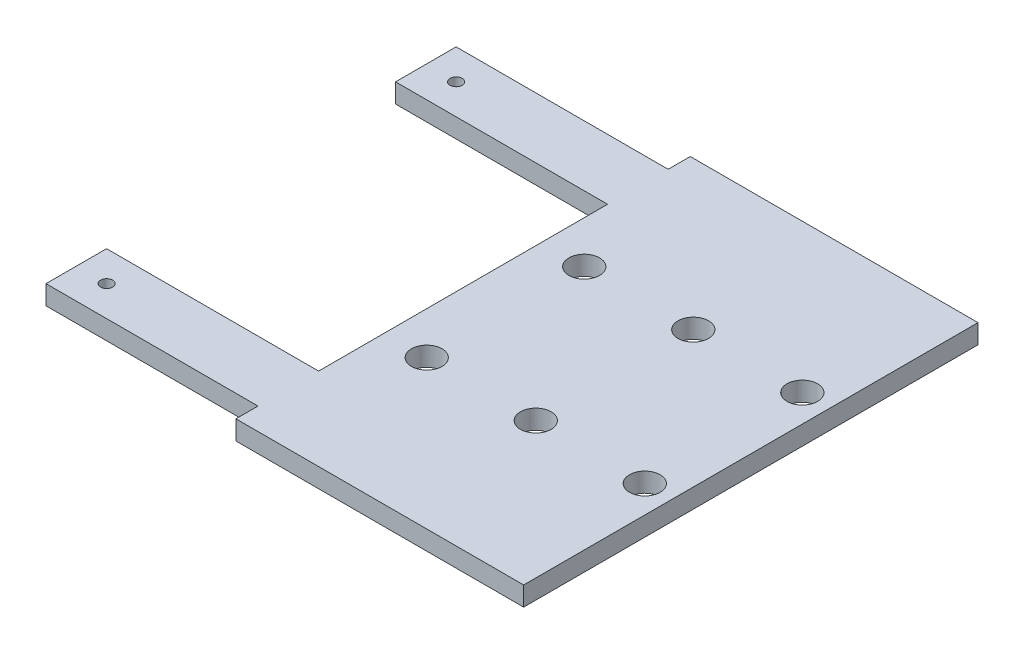
ISO-10303-21;
HEADER;
FILE_DESCRIPTION(('STEP AP214'),'2;1');
FILE_NAME('part.step','',(''),(''),'','','');
FILE_SCHEMA(('AUTOMOTIVE_DESIGN { 1 0 10303 214 1 1 1 1 }'));
ENDSEC;
DATA;
#1=APPLICATION_CONTEXT('core data for automotive mechanical design processes');
#2=APPLICATION_PROTOCOL_DEFINITION('international standard','automotive_design',2000,#1);
#3=PRODUCT_CONTEXT('',#1,'mechanical');
#4=PRODUCT('Part','Part','',(#3));
#5=PRODUCT_RELATED_PRODUCT_CATEGORY('part','',(#4));
#6=PRODUCT_DEFINITION_FORMATION('','',#4);
#7=PRODUCT_DEFINITION_CONTEXT('part definition',#1,'design');
#8=PRODUCT_DEFINITION('design','',#6,#7);
#9=PRODUCT_DEFINITION_SHAPE('','',#8);
#10=(LENGTH_UNIT() NAMED_UNIT(*) SI_UNIT(.MILLI.,.METRE.));
#11=(NAMED_UNIT(*) PLANE_ANGLE_UNIT() SI_UNIT($,.RADIAN.));
#12=(NAMED_UNIT(*) SI_UNIT($,.STERADIAN.) SOLID_ANGLE_UNIT());
#13=UNCERTAINTY_MEASURE_WITH_UNIT(LENGTH_MEASURE(1.E-05),#10,'distance_accuracy_value','');
#14=(GEOMETRIC_REPRESENTATION_CONTEXT(3) GLOBAL_UNCERTAINTY_ASSIGNED_CONTEXT((#13)) GLOBAL_UNIT_ASSIGNED_CONTEXT((#10,
#11,#12)) REPRESENTATION_CONTEXT('',''));
#15=CARTESIAN_POINT('',(0.,0.,0.));
#16=DIRECTION('',(0.,0.,1.));
#17=DIRECTION('',(1.,0.,0.));
#18=AXIS2_PLACEMENT_3D('',#15,#16,#17);
#19=CARTESIAN_POINT('',(0.,6.35,0.));
#20=DIRECTION('',(0.,-1.,0.));
#21=DIRECTION('',(0.,0.,-1.));
#22=AXIS2_PLACEMENT_3D('',#19,#20,#21);
#23=PLANE('',#22);
#24=DIRECTION('',(0.,0.,-1.));
#25=VECTOR('',#24,1.);
#26=CARTESIAN_POINT('',(45.,6.35,-75.));
#27=LINE('',#26,#25);
#28=CARTESIAN_POINT('',(45.,6.35,75.));
#29=VERTEX_POINT('',#28);
#30=CARTESIAN_POINT('',(45.,6.35,-75.));
#31=VERTEX_POINT('',#30);
#32=EDGE_CURVE('E176',#29,#31,#27,.T.);
#33=ORIENTED_EDGE('',*,*,#32,.T.);
#34=DIRECTION('',(-1.,0.,0.));
#35=VECTOR('',#34,1.);
#36=CARTESIAN_POINT('',(45.,6.35,-75.));
#37=LINE('',#36,#35);
#38=CARTESIAN_POINT('',(-50.,6.35,-75.));
#39=VERTEX_POINT('',#38);
#40=EDGE_CURVE('E104',#31,#39,#37,.T.);
#41=ORIENTED_EDGE('',*,*,#40,.T.);
#42=DIRECTION('',(0.,0.,1.));
#43=VECTOR('',#42,1.);
#44=CARTESIAN_POINT('',(-50.,6.35,-75.));
#45=LINE('',#44,#43);
#46=CARTESIAN_POINT('',(-50.,6.35,-67.7));
#47=VERTEX_POINT('',#46);
#48=EDGE_CURVE('E203',#39,#47,#45,.T.);
#49=ORIENTED_EDGE('',*,*,#48,.T.);
#50=DIRECTION('',(-1.,0.,0.));
#51=VECTOR('',#50,1.);
#52=CARTESIAN_POINT('',(-50.,6.35,-67.7));
#53=LINE('',#52,#51);
#54=CARTESIAN_POINT('',(-120.,6.35,-67.7));
#55=VERTEX_POINT('',#54);
#56=EDGE_CURVE('E222',#47,#55,#53,.T.);
#57=ORIENTED_EDGE('',*,*,#56,.T.);
#58=DIRECTION('',(0.,0.,1.));
#59=VECTOR('',#58,1.);
#60=CARTESIAN_POINT('',(-120.,6.35,-67.7));
#61=LINE('',#60,#59);
#62=CARTESIAN_POINT('',(-120.,6.35,-47.7));
#63=VERTEX_POINT('',#62);
#64=EDGE_CURVE('E219',#55,#63,#61,.T.);
#65=ORIENTED_EDGE('',*,*,#64,.T.);
#66=DIRECTION('',(1.,0.,0.));
#67=VECTOR('',#66,1.);
#68=CARTESIAN_POINT('',(-50.,6.35,-47.7));
#69=LINE('',#68,#67);
#70=CARTESIAN_POINT('',(-50.,6.35,-47.7));
#71=VERTEX_POINT('',#70);
#72=EDGE_CURVE('E221',#63,#71,#69,.T.);
#73=ORIENTED_EDGE('',*,*,#72,.T.);
#74=DIRECTION('',(0.,0.,1.));
#75=VECTOR('',#74,1.);
#76=CARTESIAN_POINT('',(-50.,6.35,47.7));
#77=LINE('',#76,#75);
#78=CARTESIAN_POINT('',(-50.,6.35,47.7));
#79=VERTEX_POINT('',#78);
#80=EDGE_CURVE('E224',#71,#79,#77,.T.);
#81=ORIENTED_EDGE('',*,*,#80,.T.);
#82=DIRECTION('',(-1.,0.,0.));
#83=VECTOR('',#82,1.);
#84=CARTESIAN_POINT('',(-120.,6.35,47.7));
#85=LINE('',#84,#83);
#86=CARTESIAN_POINT('',(-120.,6.35,47.7));
#87=VERTEX_POINT('',#86);
#88=EDGE_CURVE('E230',#79,#87,#85,.T.);
#89=ORIENTED_EDGE('',*,*,#88,.T.);
#90=DIRECTION('',(0.,0.,1.));
#91=VECTOR('',#90,1.);
#92=CARTESIAN_POINT('',(-120.,6.35,47.7));
#93=LINE('',#92,#91);
#94=CARTESIAN_POINT('',(-120.,6.35,67.7));
#95=VERTEX_POINT('',#94);
#96=EDGE_CURVE('E135',#87,#95,#93,.T.);
#97=ORIENTED_EDGE('',*,*,#96,.T.);
#98=DIRECTION('',(1.,0.,0.));
#99=VECTOR('',#98,1.);
#100=CARTESIAN_POINT('',(-120.,6.35,67.7));
#101=LINE('',#100,#99);
#102=CARTESIAN_POINT('',(-50.,6.35,67.7));
#103=VERTEX_POINT('',#102);
#104=EDGE_CURVE('E129',#95,#103,#101,.T.);
#105=ORIENTED_EDGE('',*,*,#104,.T.);
#106=DIRECTION('',(0.,0.,1.));
#107=VECTOR('',#106,1.);
#108=CARTESIAN_POINT('',(-50.,6.35,67.7));
#109=LINE('',#108,#107);
#110=CARTESIAN_POINT('',(-50.,6.35,75.));
#111=VERTEX_POINT('',#110);
#112=EDGE_CURVE('E133',#103,#111,#109,.T.);
#113=ORIENTED_EDGE('',*,*,#112,.T.);
#114=DIRECTION('',(1.,0.,0.));
#115=VECTOR('',#114,1.);
#116=CARTESIAN_POINT('',(45.,6.35,75.));
#117=LINE('',#116,#115);
#118=EDGE_CURVE('E49',#111,#29,#117,.T.);
#119=ORIENTED_EDGE('',*,*,#118,.T.);
#120=EDGE_LOOP('',(#33,#41,#49,#57,#65,#73,#81,#89,#97,#105,#113,#119));
#121=FACE_BOUND('',#120,.T.);
#122=CARTESIAN_POINT('',(-36.,6.35,-26.));
#123=DIRECTION('',(0.,1.,0.));
#124=DIRECTION('',(0.,0.,1.));
#125=AXIS2_PLACEMENT_3D('',#122,#123,#124);
#126=CIRCLE('',#125,5.05);
#127=CARTESIAN_POINT('',(-36.,6.35,-20.95));
#128=VERTEX_POINT('',#127);
#129=EDGE_CURVE('E157',#128,#128,#126,.T.);
#130=ORIENTED_EDGE('',*,*,#129,.F.);
#131=EDGE_LOOP('',(#130));
#132=FACE_BOUND('',#131,.T.);
#133=CARTESIAN_POINT('',(36.,6.35,-26.));
#134=DIRECTION('',(0.,1.,0.));
#135=DIRECTION('',(0.,0.,1.));
#136=AXIS2_PLACEMENT_3D('',#133,#134,#135);
#137=CIRCLE('',#136,5.05);
#138=CARTESIAN_POINT('',(36.,6.35,-20.95));
#139=VERTEX_POINT('',#138);
#140=EDGE_CURVE('E334',#139,#139,#137,.T.);
#141=ORIENTED_EDGE('',*,*,#140,.F.);
#142=EDGE_LOOP('',(#141));
#143=FACE_BOUND('',#142,.T.);
#144=CARTESIAN_POINT('',(36.,6.35,26.));
#145=DIRECTION('',(0.,1.,0.));
#146=DIRECTION('',(0.,0.,1.));
#147=AXIS2_PLACEMENT_3D('',#144,#145,#146);
#148=CIRCLE('',#147,5.05);
#149=CARTESIAN_POINT('',(36.,6.35,31.05));
#150=VERTEX_POINT('',#149);
#151=EDGE_CURVE('E328',#150,#150,#148,.T.);
#152=ORIENTED_EDGE('',*,*,#151,.F.);
#153=EDGE_LOOP('',(#152));
#154=FACE_BOUND('',#153,.T.);
#155=CARTESIAN_POINT('',(-36.,6.35,26.));
#156=DIRECTION('',(0.,1.,0.));
#157=DIRECTION('',(0.,0.,1.));
#158=AXIS2_PLACEMENT_3D('',#155,#156,#157);
#159=CIRCLE('',#158,5.05);
#160=CARTESIAN_POINT('',(-36.,6.35,31.05));
#161=VERTEX_POINT('',#160);
#162=EDGE_CURVE('E322',#161,#161,#159,.T.);
#163=ORIENTED_EDGE('',*,*,#162,.F.);
#164=EDGE_LOOP('',(#163));
#165=FACE_BOUND('',#164,.T.);
#166=CARTESIAN_POINT('',(0.,6.35,-26.));
#167=DIRECTION('',(0.,1.,0.));
#168=DIRECTION('',(0.,0.,1.));
#169=AXIS2_PLACEMENT_3D('',#166,#167,#168);
#170=CIRCLE('',#169,5.05);
#171=CARTESIAN_POINT('',(0.,6.35,-20.95));
#172=VERTEX_POINT('',#171);
#173=EDGE_CURVE('E316',#172,#172,#170,.T.);
#174=ORIENTED_EDGE('',*,*,#173,.F.);
#175=EDGE_LOOP('',(#174));
#176=FACE_BOUND('',#175,.T.);
#177=CARTESIAN_POINT('',(0.,6.35,26.));
#178=DIRECTION('',(0.,1.,0.));
#179=DIRECTION('',(0.,0.,1.));
#180=AXIS2_PLACEMENT_3D('',#177,#178,#179);
#181=CIRCLE('',#180,5.05);
#182=CARTESIAN_POINT('',(0.,6.35,31.05));
#183=VERTEX_POINT('',#182);
#184=EDGE_CURVE('E310',#183,#183,#181,.T.);
#185=ORIENTED_EDGE('',*,*,#184,.F.);
#186=EDGE_LOOP('',(#185));
#187=FACE_BOUND('',#186,.T.);
#188=CARTESIAN_POINT('',(-110.,6.35,57.7));
#189=DIRECTION('',(0.,1.,0.));
#190=DIRECTION('',(0.,0.,1.));
#191=AXIS2_PLACEMENT_3D('',#188,#189,#190);
#192=CIRCLE('',#191,2.);
#193=CARTESIAN_POINT('',(-110.,6.35,59.7));
#194=VERTEX_POINT('',#193);
#195=EDGE_CURVE('E304',#194,#194,#192,.T.);
#196=ORIENTED_EDGE('',*,*,#195,.F.);
#197=EDGE_LOOP('',(#196));
#198=FACE_BOUND('',#197,.T.);
#199=CARTESIAN_POINT('',(-110.,6.35,-57.7));
#200=DIRECTION('',(0.,1.,0.));
#201=DIRECTION('',(0.,0.,1.));
#202=AXIS2_PLACEMENT_3D('',#199,#200,#201);
#203=CIRCLE('',#202,2.);
#204=CARTESIAN_POINT('',(-110.,6.35,-55.7));
#205=VERTEX_POINT('',#204);
#206=EDGE_CURVE('E295',#205,#205,#203,.T.);
#207=ORIENTED_EDGE('',*,*,#206,.F.);
#208=EDGE_LOOP('',(#207));
#209=FACE_BOUND('',#208,.T.);
#210=ADVANCED_FACE('F32',(#121,#132,#143,#154,#165,#176,#187,#198,#209),#23,.F.);
#211=CARTESIAN_POINT('',(0.,0.,0.));
#212=DIRECTION('',(0.,-1.,0.));
#213=DIRECTION('',(0.,0.,-1.));
#214=AXIS2_PLACEMENT_3D('',#211,#212,#213);
#215=PLANE('',#214);
#216=CARTESIAN_POINT('',(-110.,0.,57.7));
#217=DIRECTION('',(0.,1.,0.));
#218=DIRECTION('',(0.,0.,1.));
#219=AXIS2_PLACEMENT_3D('',#216,#217,#218);
#220=CIRCLE('',#219,2.);
#221=CARTESIAN_POINT('',(-110.,0.,59.7));
#222=VERTEX_POINT('',#221);
#223=EDGE_CURVE('E301',#222,#222,#220,.T.);
#224=ORIENTED_EDGE('',*,*,#223,.T.);
#225=EDGE_LOOP('',(#224));
#226=FACE_BOUND('',#225,.T.);
#227=CARTESIAN_POINT('',(0.,0.,-26.));
#228=DIRECTION('',(0.,1.,0.));
#229=DIRECTION('',(0.,0.,1.));
#230=AXIS2_PLACEMENT_3D('',#227,#228,#229);
#231=CIRCLE('',#230,5.05);
#232=CARTESIAN_POINT('',(0.,0.,-20.95));
#233=VERTEX_POINT('',#232);
#234=EDGE_CURVE('E313',#233,#233,#231,.T.);
#235=ORIENTED_EDGE('',*,*,#234,.T.);
#236=EDGE_LOOP('',(#235));
#237=FACE_BOUND('',#236,.T.);
#238=CARTESIAN_POINT('',(36.,0.,26.));
#239=DIRECTION('',(0.,1.,0.));
#240=DIRECTION('',(0.,0.,1.));
#241=AXIS2_PLACEMENT_3D('',#238,#239,#240);
#242=CIRCLE('',#241,5.05);
#243=CARTESIAN_POINT('',(36.,0.,31.05));
#244=VERTEX_POINT('',#243);
#245=EDGE_CURVE('E325',#244,#244,#242,.T.);
#246=ORIENTED_EDGE('',*,*,#245,.T.);
#247=EDGE_LOOP('',(#246));
#248=FACE_BOUND('',#247,.T.);
#249=CARTESIAN_POINT('',(-36.,0.,-26.));
#250=DIRECTION('',(0.,1.,0.));
#251=DIRECTION('',(0.,0.,1.));
#252=AXIS2_PLACEMENT_3D('',#249,#250,#251);
#253=CIRCLE('',#252,5.05);
#254=CARTESIAN_POINT('',(-36.,0.,-20.95));
#255=VERTEX_POINT('',#254);
#256=EDGE_CURVE('E337',#255,#255,#253,.T.);
#257=ORIENTED_EDGE('',*,*,#256,.T.);
#258=EDGE_LOOP('',(#257));
#259=FACE_BOUND('',#258,.T.);
#260=DIRECTION('',(0.,0.,-1.));
#261=VECTOR('',#260,1.);
#262=CARTESIAN_POINT('',(45.,0.,-75.));
#263=LINE('',#262,#261);
#264=CARTESIAN_POINT('',(45.,0.,75.));
#265=VERTEX_POINT('',#264);
#266=CARTESIAN_POINT('',(45.,0.,-75.));
#267=VERTEX_POINT('',#266);
#268=EDGE_CURVE('E153',#265,#267,#263,.T.);
#269=ORIENTED_EDGE('',*,*,#268,.F.);
#270=DIRECTION('',(1.,0.,0.));
#271=VECTOR('',#270,1.);
#272=CARTESIAN_POINT('',(45.,0.,75.));
#273=LINE('',#272,#271);
#274=CARTESIAN_POINT('',(-50.,0.,75.));
#275=VERTEX_POINT('',#274);
#276=EDGE_CURVE('E96',#275,#265,#273,.T.);
#277=ORIENTED_EDGE('',*,*,#276,.F.);
#278=DIRECTION('',(0.,0.,1.));
#279=VECTOR('',#278,1.);
#280=CARTESIAN_POINT('',(-50.,0.,67.7));
#281=LINE('',#280,#279);
#282=CARTESIAN_POINT('',(-50.,0.,67.7));
#283=VERTEX_POINT('',#282);
#284=EDGE_CURVE('E90',#283,#275,#281,.T.);
#285=ORIENTED_EDGE('',*,*,#284,.F.);
#286=DIRECTION('',(1.,0.,0.));
#287=VECTOR('',#286,1.);
#288=CARTESIAN_POINT('',(-120.,0.,67.7));
#289=LINE('',#288,#287);
#290=CARTESIAN_POINT('',(-120.,0.,67.7));
#291=VERTEX_POINT('',#290);
#292=EDGE_CURVE('E143',#291,#283,#289,.T.);
#293=ORIENTED_EDGE('',*,*,#292,.F.);
#294=DIRECTION('',(0.,0.,1.));
#295=VECTOR('',#294,1.);
#296=CARTESIAN_POINT('',(-120.,0.,47.7));
#297=LINE('',#296,#295);
#298=CARTESIAN_POINT('',(-120.,0.,47.7));
#299=VERTEX_POINT('',#298);
#300=EDGE_CURVE('E171',#299,#291,#297,.T.);
#301=ORIENTED_EDGE('',*,*,#300,.F.);
#302=DIRECTION('',(-1.,0.,0.));
#303=VECTOR('',#302,1.);
#304=CARTESIAN_POINT('',(-120.,0.,47.7));
#305=LINE('',#304,#303);
#306=CARTESIAN_POINT('',(-50.,0.,47.7));
#307=VERTEX_POINT('',#306);
#308=EDGE_CURVE('E169',#307,#299,#305,.T.);
#309=ORIENTED_EDGE('',*,*,#308,.F.);
#310=DIRECTION('',(0.,0.,1.));
#311=VECTOR('',#310,1.);
#312=CARTESIAN_POINT('',(-50.,0.,47.7));
#313=LINE('',#312,#311);
#314=CARTESIAN_POINT('',(-50.,0.,-47.7));
#315=VERTEX_POINT('',#314);
#316=EDGE_CURVE('E167',#315,#307,#313,.T.);
#317=ORIENTED_EDGE('',*,*,#316,.F.);
#318=DIRECTION('',(1.,0.,0.));
#319=VECTOR('',#318,1.);
#320=CARTESIAN_POINT('',(-50.,0.,-47.7));
#321=LINE('',#320,#319);
#322=CARTESIAN_POINT('',(-120.,0.,-47.7));
#323=VERTEX_POINT('',#322);
#324=EDGE_CURVE('E165',#323,#315,#321,.T.);
#325=ORIENTED_EDGE('',*,*,#324,.F.);
#326=DIRECTION('',(0.,0.,1.));
#327=VECTOR('',#326,1.);
#328=CARTESIAN_POINT('',(-120.,0.,-67.7));
#329=LINE('',#328,#327);
#330=CARTESIAN_POINT('',(-120.,0.,-67.7));
#331=VERTEX_POINT('',#330);
#332=EDGE_CURVE('E163',#331,#323,#329,.T.);
#333=ORIENTED_EDGE('',*,*,#332,.F.);
#334=DIRECTION('',(-1.,0.,0.));
#335=VECTOR('',#334,1.);
#336=CARTESIAN_POINT('',(-50.,0.,-67.7));
#337=LINE('',#336,#335);
#338=CARTESIAN_POINT('',(-50.,0.,-67.7));
#339=VERTEX_POINT('',#338);
#340=EDGE_CURVE('E161',#339,#331,#337,.T.);
#341=ORIENTED_EDGE('',*,*,#340,.F.);
#342=DIRECTION('',(0.,0.,1.));
#343=VECTOR('',#342,1.);
#344=CARTESIAN_POINT('',(-50.,0.,-75.));
#345=LINE('',#344,#343);
#346=CARTESIAN_POINT('',(-50.,0.,-75.));
#347=VERTEX_POINT('',#346);
#348=EDGE_CURVE('E159',#347,#339,#345,.T.);
#349=ORIENTED_EDGE('',*,*,#348,.F.);
#350=DIRECTION('',(-1.,0.,0.));
#351=VECTOR('',#350,1.);
#352=CARTESIAN_POINT('',(45.,0.,-75.));
#353=LINE('',#352,#351);
#354=EDGE_CURVE('E156',#267,#347,#353,.T.);
#355=ORIENTED_EDGE('',*,*,#354,.F.);
#356=EDGE_LOOP('',(#269,#277,#285,#293,#301,#309,#317,#325,#333,#341,#349,#355));
#357=FACE_BOUND('',#356,.T.);
#358=CARTESIAN_POINT('',(36.,0.,-26.));
#359=DIRECTION('',(0.,1.,0.));
#360=DIRECTION('',(0.,0.,1.));
#361=AXIS2_PLACEMENT_3D('',#358,#359,#360);
#362=CIRCLE('',#361,5.05);
#363=CARTESIAN_POINT('',(36.,0.,-20.95));
#364=VERTEX_POINT('',#363);
#365=EDGE_CURVE('E331',#364,#364,#362,.T.);
#366=ORIENTED_EDGE('',*,*,#365,.T.);
#367=EDGE_LOOP('',(#366));
#368=FACE_BOUND('',#367,.T.);
#369=CARTESIAN_POINT('',(-36.,0.,26.));
#370=DIRECTION('',(0.,1.,0.));
#371=DIRECTION('',(0.,0.,1.));
#372=AXIS2_PLACEMENT_3D('',#369,#370,#371);
#373=CIRCLE('',#372,5.05);
#374=CARTESIAN_POINT('',(-36.,0.,31.05));
#375=VERTEX_POINT('',#374);
#376=EDGE_CURVE('E319',#375,#375,#373,.T.);
#377=ORIENTED_EDGE('',*,*,#376,.T.);
#378=EDGE_LOOP('',(#377));
#379=FACE_BOUND('',#378,.T.);
#380=CARTESIAN_POINT('',(0.,0.,26.));
#381=DIRECTION('',(0.,1.,0.));
#382=DIRECTION('',(0.,0.,1.));
#383=AXIS2_PLACEMENT_3D('',#380,#381,#382);
#384=CIRCLE('',#383,5.05);
#385=CARTESIAN_POINT('',(0.,0.,31.05));
#386=VERTEX_POINT('',#385);
#387=EDGE_CURVE('E307',#386,#386,#384,.T.);
#388=ORIENTED_EDGE('',*,*,#387,.T.);
#389=EDGE_LOOP('',(#388));
#390=FACE_BOUND('',#389,.T.);
#391=CARTESIAN_POINT('',(-110.,0.,-57.7));
#392=DIRECTION('',(0.,1.,0.));
#393=DIRECTION('',(0.,0.,1.));
#394=AXIS2_PLACEMENT_3D('',#391,#392,#393);
#395=CIRCLE('',#394,2.);
#396=CARTESIAN_POINT('',(-110.,0.,-55.7));
#397=VERTEX_POINT('',#396);
#398=EDGE_CURVE('E298',#397,#397,#395,.T.);
#399=ORIENTED_EDGE('',*,*,#398,.T.);
#400=EDGE_LOOP('',(#399));
#401=FACE_BOUND('',#400,.T.);
#402=ADVANCED_FACE('F207',(#226,#237,#248,#259,#357,#368,#379,#390,#401),#215,.T.);
#403=CARTESIAN_POINT('',(45.,6.35,-75.));
#404=DIRECTION('',(-1.,0.,0.));
#405=DIRECTION('',(0.,0.,1.));
#406=AXIS2_PLACEMENT_3D('',#403,#404,#405);
#407=PLANE('',#406);
#408=ORIENTED_EDGE('',*,*,#268,.T.);
#409=DIRECTION('',(0.,-1.,0.));
#410=VECTOR('',#409,1.);
#411=CARTESIAN_POINT('',(45.,6.35,-75.));
#412=LINE('',#411,#410);
#413=EDGE_CURVE('E11',#31,#267,#412,.T.);
#414=ORIENTED_EDGE('',*,*,#413,.F.);
#415=ORIENTED_EDGE('',*,*,#32,.F.);
#416=DIRECTION('',(0.,-1.,0.));
#417=VECTOR('',#416,1.);
#418=CARTESIAN_POINT('',(45.,6.35,75.));
#419=LINE('',#418,#417);
#420=EDGE_CURVE('E149',#29,#265,#419,.T.);
#421=ORIENTED_EDGE('',*,*,#420,.T.);
#422=EDGE_LOOP('',(#408,#414,#415,#421));
#423=FACE_BOUND('',#422,.T.);
#424=ADVANCED_FACE('F34',(#423),#407,.F.);
#425=CARTESIAN_POINT('',(45.,6.35,-75.));
#426=DIRECTION('',(0.,0.,1.));
#427=DIRECTION('',(1.,0.,0.));
#428=AXIS2_PLACEMENT_3D('',#425,#426,#427);
#429=PLANE('',#428);
#430=ORIENTED_EDGE('',*,*,#354,.T.);
#431=DIRECTION('',(0.,-1.,0.));
#432=VECTOR('',#431,1.);
#433=CARTESIAN_POINT('',(-50.,6.35,-75.));
#434=LINE('',#433,#432);
#435=EDGE_CURVE('E41',#39,#347,#434,.T.);
#436=ORIENTED_EDGE('',*,*,#435,.F.);
#437=ORIENTED_EDGE('',*,*,#40,.F.);
#438=ORIENTED_EDGE('',*,*,#413,.T.);
#439=EDGE_LOOP('',(#430,#436,#437,#438));
#440=FACE_BOUND('',#439,.T.);
#441=ADVANCED_FACE('F485',(#440),#429,.F.);
#442=CARTESIAN_POINT('',(-50.,6.35,-75.));
#443=DIRECTION('',(1.,0.,0.));
#444=DIRECTION('',(0.,0.,-1.));
#445=AXIS2_PLACEMENT_3D('',#442,#443,#444);
#446=PLANE('',#445);
#447=ORIENTED_EDGE('',*,*,#348,.T.);
#448=DIRECTION('',(0.,-1.,0.));
#449=VECTOR('',#448,1.);
#450=CARTESIAN_POINT('',(-50.,6.35,-67.7));
#451=LINE('',#450,#449);
#452=EDGE_CURVE('E195',#47,#339,#451,.T.);
#453=ORIENTED_EDGE('',*,*,#452,.F.);
#454=ORIENTED_EDGE('',*,*,#48,.F.);
#455=ORIENTED_EDGE('',*,*,#435,.T.);
#456=EDGE_LOOP('',(#447,#453,#454,#455));
#457=FACE_BOUND('',#456,.T.);
#458=ADVANCED_FACE('F201',(#457),#446,.F.);
#459=CARTESIAN_POINT('',(-50.,6.35,-67.7));
#460=DIRECTION('',(0.,0.,1.));
#461=DIRECTION('',(1.,0.,0.));
#462=AXIS2_PLACEMENT_3D('',#459,#460,#461);
#463=PLANE('',#462);
#464=ORIENTED_EDGE('',*,*,#340,.T.);
#465=DIRECTION('',(0.,-1.,0.));
#466=VECTOR('',#465,1.);
#467=CARTESIAN_POINT('',(-120.,6.35,-67.7));
#468=LINE('',#467,#466);
#469=EDGE_CURVE('E192',#55,#331,#468,.T.);
#470=ORIENTED_EDGE('',*,*,#469,.F.);
#471=ORIENTED_EDGE('',*,*,#56,.F.);
#472=ORIENTED_EDGE('',*,*,#452,.T.);
#473=EDGE_LOOP('',(#464,#470,#471,#472));
#474=FACE_BOUND('',#473,.T.);
#475=ADVANCED_FACE('F213',(#474),#463,.F.);
#476=CARTESIAN_POINT('',(-120.,6.35,-67.7));
#477=DIRECTION('',(1.,0.,0.));
#478=DIRECTION('',(0.,0.,-1.));
#479=AXIS2_PLACEMENT_3D('',#476,#477,#478);
#480=PLANE('',#479);
#481=ORIENTED_EDGE('',*,*,#332,.T.);
#482=DIRECTION('',(0.,-1.,0.));
#483=VECTOR('',#482,1.);
#484=CARTESIAN_POINT('',(-120.,6.35,-47.7));
#485=LINE('',#484,#483);
#486=EDGE_CURVE('E189',#63,#323,#485,.T.);
#487=ORIENTED_EDGE('',*,*,#486,.F.);
#488=ORIENTED_EDGE('',*,*,#64,.F.);
#489=ORIENTED_EDGE('',*,*,#469,.T.);
#490=EDGE_LOOP('',(#481,#487,#488,#489));
#491=FACE_BOUND('',#490,.T.);
#492=ADVANCED_FACE('F217',(#491),#480,.F.);
#493=CARTESIAN_POINT('',(-50.,6.35,-47.7));
#494=DIRECTION('',(0.,0.,-1.));
#495=DIRECTION('',(-1.,0.,0.));
#496=AXIS2_PLACEMENT_3D('',#493,#494,#495);
#497=PLANE('',#496);
#498=ORIENTED_EDGE('',*,*,#324,.T.);
#499=DIRECTION('',(0.,-1.,0.));
#500=VECTOR('',#499,1.);
#501=CARTESIAN_POINT('',(-50.,6.35,-47.7));
#502=LINE('',#501,#500);
#503=EDGE_CURVE('E186',#71,#315,#502,.T.);
#504=ORIENTED_EDGE('',*,*,#503,.F.);
#505=ORIENTED_EDGE('',*,*,#72,.F.);
#506=ORIENTED_EDGE('',*,*,#486,.T.);
#507=EDGE_LOOP('',(#498,#504,#505,#506));
#508=FACE_BOUND('',#507,.T.);
#509=ADVANCED_FACE('F450',(#508),#497,.F.);
#510=CARTESIAN_POINT('',(-50.,6.35,47.7));
#511=DIRECTION('',(1.,0.,0.));
#512=DIRECTION('',(0.,0.,-1.));
#513=AXIS2_PLACEMENT_3D('',#510,#511,#512);
#514=PLANE('',#513);
#515=ORIENTED_EDGE('',*,*,#316,.T.);
#516=DIRECTION('',(0.,-1.,0.));
#517=VECTOR('',#516,1.);
#518=CARTESIAN_POINT('',(-50.,6.35,47.7));
#519=LINE('',#518,#517);
#520=EDGE_CURVE('E183',#79,#307,#519,.T.);
#521=ORIENTED_EDGE('',*,*,#520,.F.);
#522=ORIENTED_EDGE('',*,*,#80,.F.);
#523=ORIENTED_EDGE('',*,*,#503,.T.);
#524=EDGE_LOOP('',(#515,#521,#522,#523));
#525=FACE_BOUND('',#524,.T.);
#526=ADVANCED_FACE('F441',(#525),#514,.F.);
#527=CARTESIAN_POINT('',(-120.,6.35,47.7));
#528=DIRECTION('',(0.,0.,1.));
#529=DIRECTION('',(1.,0.,0.));
#530=AXIS2_PLACEMENT_3D('',#527,#528,#529);
#531=PLANE('',#530);
#532=ORIENTED_EDGE('',*,*,#308,.T.);
#533=DIRECTION('',(0.,-1.,0.));
#534=VECTOR('',#533,1.);
#535=CARTESIAN_POINT('',(-120.,6.35,47.7));
#536=LINE('',#535,#534);
#537=EDGE_CURVE('E180',#87,#299,#536,.T.);
#538=ORIENTED_EDGE('',*,*,#537,.F.);
#539=ORIENTED_EDGE('',*,*,#88,.F.);
#540=ORIENTED_EDGE('',*,*,#520,.T.);
#541=EDGE_LOOP('',(#532,#538,#539,#540));
#542=FACE_BOUND('',#541,.T.);
#543=ADVANCED_FACE('F236',(#542),#531,.F.);
#544=CARTESIAN_POINT('',(-120.,6.35,47.7));
#545=DIRECTION('',(1.,0.,0.));
#546=DIRECTION('',(0.,0.,-1.));
#547=AXIS2_PLACEMENT_3D('',#544,#545,#546);
#548=PLANE('',#547);
#549=ORIENTED_EDGE('',*,*,#300,.T.);
#550=DIRECTION('',(0.,-1.,0.));
#551=VECTOR('',#550,1.);
#552=CARTESIAN_POINT('',(-120.,6.35,67.7));
#553=LINE('',#552,#551);
#554=EDGE_CURVE('E144',#95,#291,#553,.T.);
#555=ORIENTED_EDGE('',*,*,#554,.F.);
#556=ORIENTED_EDGE('',*,*,#96,.F.);
#557=ORIENTED_EDGE('',*,*,#537,.T.);
#558=EDGE_LOOP('',(#549,#555,#556,#557));
#559=FACE_BOUND('',#558,.T.);
#560=ADVANCED_FACE('F240',(#559),#548,.F.);
#561=CARTESIAN_POINT('',(-120.,6.35,67.7));
#562=DIRECTION('',(0.,0.,-1.));
#563=DIRECTION('',(-1.,0.,0.));
#564=AXIS2_PLACEMENT_3D('',#561,#562,#563);
#565=PLANE('',#564);
#566=ORIENTED_EDGE('',*,*,#292,.T.);
#567=DIRECTION('',(0.,-1.,0.));
#568=VECTOR('',#567,1.);
#569=CARTESIAN_POINT('',(-50.,6.35,67.7));
#570=LINE('',#569,#568);
#571=EDGE_CURVE('E140',#103,#283,#570,.T.);
#572=ORIENTED_EDGE('',*,*,#571,.F.);
#573=ORIENTED_EDGE('',*,*,#104,.F.);
#574=ORIENTED_EDGE('',*,*,#554,.T.);
#575=EDGE_LOOP('',(#566,#572,#573,#574));
#576=FACE_BOUND('',#575,.T.);
#577=ADVANCED_FACE('F141',(#576),#565,.F.);
#578=CARTESIAN_POINT('',(-50.,6.35,67.7));
#579=DIRECTION('',(1.,0.,0.));
#580=DIRECTION('',(0.,0.,-1.));
#581=AXIS2_PLACEMENT_3D('',#578,#579,#580);
#582=PLANE('',#581);
#583=ORIENTED_EDGE('',*,*,#284,.T.);
#584=DIRECTION('',(0.,-1.,0.));
#585=VECTOR('',#584,1.);
#586=CARTESIAN_POINT('',(-50.,6.35,75.));
#587=LINE('',#586,#585);
#588=EDGE_CURVE('E145',#111,#275,#587,.T.);
#589=ORIENTED_EDGE('',*,*,#588,.F.);
#590=ORIENTED_EDGE('',*,*,#112,.F.);
#591=ORIENTED_EDGE('',*,*,#571,.T.);
#592=EDGE_LOOP('',(#583,#589,#590,#591));
#593=FACE_BOUND('',#592,.T.);
#594=ADVANCED_FACE('F147',(#593),#582,.F.);
#595=CARTESIAN_POINT('',(45.,6.35,75.));
#596=DIRECTION('',(0.,0.,-1.));
#597=DIRECTION('',(-1.,0.,0.));
#598=AXIS2_PLACEMENT_3D('',#595,#596,#597);
#599=PLANE('',#598);
#600=ORIENTED_EDGE('',*,*,#276,.T.);
#601=ORIENTED_EDGE('',*,*,#420,.F.);
#602=ORIENTED_EDGE('',*,*,#118,.F.);
#603=ORIENTED_EDGE('',*,*,#588,.T.);
#604=EDGE_LOOP('',(#600,#601,#602,#603));
#605=FACE_BOUND('',#604,.T.);
#606=ADVANCED_FACE('F244',(#605),#599,.F.);
#607=CARTESIAN_POINT('',(-36.,6.35,-26.));
#608=DIRECTION('',(0.,-1.,0.));
#609=DIRECTION('',(0.,0.,-1.));
#610=AXIS2_PLACEMENT_3D('',#607,#608,#609);
#611=CYLINDRICAL_SURFACE('',#610,5.05);
#612=ORIENTED_EDGE('',*,*,#129,.T.);
#613=EDGE_LOOP('',(#612));
#614=FACE_BOUND('',#613,.T.);
#615=ORIENTED_EDGE('',*,*,#256,.F.);
#616=EDGE_LOOP('',(#615));
#617=FACE_BOUND('',#616,.T.);
#618=ADVANCED_FACE('F246',(#614,#617),#611,.F.);
#619=CARTESIAN_POINT('',(36.,6.35,-26.));
#620=DIRECTION('',(0.,-1.,0.));
#621=DIRECTION('',(0.,0.,-1.));
#622=AXIS2_PLACEMENT_3D('',#619,#620,#621);
#623=CYLINDRICAL_SURFACE('',#622,5.05);
#624=ORIENTED_EDGE('',*,*,#140,.T.);
#625=EDGE_LOOP('',(#624));
#626=FACE_BOUND('',#625,.T.);
#627=ORIENTED_EDGE('',*,*,#365,.F.);
#628=EDGE_LOOP('',(#627));
#629=FACE_BOUND('',#628,.T.);
#630=ADVANCED_FACE('F252',(#626,#629),#623,.F.);
#631=CARTESIAN_POINT('',(36.,6.35,26.));
#632=DIRECTION('',(0.,-1.,0.));
#633=DIRECTION('',(0.,0.,-1.));
#634=AXIS2_PLACEMENT_3D('',#631,#632,#633);
#635=CYLINDRICAL_SURFACE('',#634,5.05);
#636=ORIENTED_EDGE('',*,*,#151,.T.);
#637=EDGE_LOOP('',(#636));
#638=FACE_BOUND('',#637,.T.);
#639=ORIENTED_EDGE('',*,*,#245,.F.);
#640=EDGE_LOOP('',(#639));
#641=FACE_BOUND('',#640,.T.);
#642=ADVANCED_FACE('F266',(#638,#641),#635,.F.);
#643=CARTESIAN_POINT('',(-36.,6.35,26.));
#644=DIRECTION('',(0.,-1.,0.));
#645=DIRECTION('',(0.,0.,-1.));
#646=AXIS2_PLACEMENT_3D('',#643,#644,#645);
#647=CYLINDRICAL_SURFACE('',#646,5.05);
#648=ORIENTED_EDGE('',*,*,#162,.T.);
#649=EDGE_LOOP('',(#648));
#650=FACE_BOUND('',#649,.T.);
#651=ORIENTED_EDGE('',*,*,#376,.F.);
#652=EDGE_LOOP('',(#651));
#653=FACE_BOUND('',#652,.T.);
#654=ADVANCED_FACE('F270',(#650,#653),#647,.F.);
#655=CARTESIAN_POINT('',(0.,6.35,-26.));
#656=DIRECTION('',(0.,-1.,0.));
#657=DIRECTION('',(0.,0.,-1.));
#658=AXIS2_PLACEMENT_3D('',#655,#656,#657);
#659=CYLINDRICAL_SURFACE('',#658,5.05);
#660=ORIENTED_EDGE('',*,*,#173,.T.);
#661=EDGE_LOOP('',(#660));
#662=FACE_BOUND('',#661,.T.);
#663=ORIENTED_EDGE('',*,*,#234,.F.);
#664=EDGE_LOOP('',(#663));
#665=FACE_BOUND('',#664,.T.);
#666=ADVANCED_FACE('F274',(#662,#665),#659,.F.);
#667=CARTESIAN_POINT('',(0.,6.35,26.));
#668=DIRECTION('',(0.,-1.,0.));
#669=DIRECTION('',(0.,0.,-1.));
#670=AXIS2_PLACEMENT_3D('',#667,#668,#669);
#671=CYLINDRICAL_SURFACE('',#670,5.05);
#672=ORIENTED_EDGE('',*,*,#184,.T.);
#673=EDGE_LOOP('',(#672));
#674=FACE_BOUND('',#673,.T.);
#675=ORIENTED_EDGE('',*,*,#387,.F.);
#676=EDGE_LOOP('',(#675));
#677=FACE_BOUND('',#676,.T.);
#678=ADVANCED_FACE('F278',(#674,#677),#671,.F.);
#679=CARTESIAN_POINT('',(-110.,6.35,57.7));
#680=DIRECTION('',(0.,-1.,0.));
#681=DIRECTION('',(0.,0.,-1.));
#682=AXIS2_PLACEMENT_3D('',#679,#680,#681);
#683=CYLINDRICAL_SURFACE('',#682,2.);
#684=ORIENTED_EDGE('',*,*,#195,.T.);
#685=EDGE_LOOP('',(#684));
#686=FACE_BOUND('',#685,.T.);
#687=ORIENTED_EDGE('',*,*,#223,.F.);
#688=EDGE_LOOP('',(#687));
#689=FACE_BOUND('',#688,.T.);
#690=ADVANCED_FACE('F282',(#686,#689),#683,.F.);
#691=CARTESIAN_POINT('',(-110.,6.35,-57.7));
#692=DIRECTION('',(0.,-1.,0.));
#693=DIRECTION('',(0.,0.,-1.));
#694=AXIS2_PLACEMENT_3D('',#691,#692,#693);
#695=CYLINDRICAL_SURFACE('',#694,2.);
#696=ORIENTED_EDGE('',*,*,#206,.T.);
#697=EDGE_LOOP('',(#696));
#698=FACE_BOUND('',#697,.T.);
#699=ORIENTED_EDGE('',*,*,#398,.F.);
#700=EDGE_LOOP('',(#699));
#701=FACE_BOUND('',#700,.T.);
#702=ADVANCED_FACE('F286',(#698,#701),#695,.F.);
#703=CLOSED_SHELL('',(#210,#402,#424,#441,#458,#475,#492,#509,#526,#543,#560,#577,#594,#606,
#618,#630,#642,#654,#666,#678,#690,#702));
#704=MANIFOLD_SOLID_BREP('B2',#703);
#705=ADVANCED_BREP_SHAPE_REPRESENTATION('',(#18,#704),#14);
#706=SHAPE_DEFINITION_REPRESENTATION(#9,#705);
ENDSEC;
END-ISO-10303-21;
